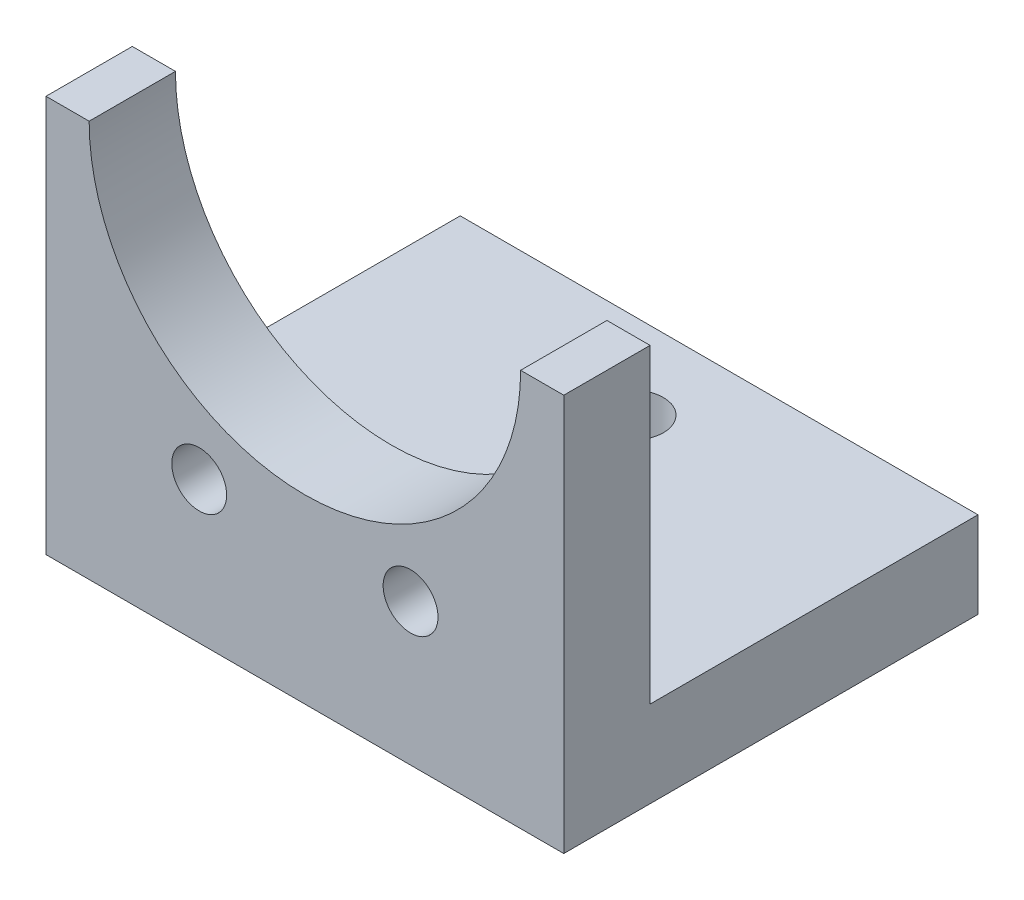
ISO-10303-21;
HEADER;
FILE_DESCRIPTION(('STEP AP214'),'2;1');
FILE_NAME('part.step','',(''),(''),'','','');
FILE_SCHEMA(('AUTOMOTIVE_DESIGN { 1 0 10303 214 1 1 1 1 }'));
ENDSEC;
DATA;
#1=APPLICATION_CONTEXT('core data for automotive mechanical design processes');
#2=APPLICATION_PROTOCOL_DEFINITION('international standard','automotive_design',2000,#1);
#3=PRODUCT_CONTEXT('',#1,'mechanical');
#4=PRODUCT('Part','Part','',(#3));
#5=PRODUCT_RELATED_PRODUCT_CATEGORY('part','',(#4));
#6=PRODUCT_DEFINITION_FORMATION('','',#4);
#7=PRODUCT_DEFINITION_CONTEXT('part definition',#1,'design');
#8=PRODUCT_DEFINITION('design','',#6,#7);
#9=PRODUCT_DEFINITION_SHAPE('','',#8);
#10=(LENGTH_UNIT() NAMED_UNIT(*) SI_UNIT(.MILLI.,.METRE.));
#11=(NAMED_UNIT(*) PLANE_ANGLE_UNIT() SI_UNIT($,.RADIAN.));
#12=(NAMED_UNIT(*) SI_UNIT($,.STERADIAN.) SOLID_ANGLE_UNIT());
#13=UNCERTAINTY_MEASURE_WITH_UNIT(LENGTH_MEASURE(1.E-05),#10,'distance_accuracy_value','');
#14=(GEOMETRIC_REPRESENTATION_CONTEXT(3) GLOBAL_UNCERTAINTY_ASSIGNED_CONTEXT((#13)) GLOBAL_UNIT_ASSIGNED_CONTEXT((#10,
#11,#12)) REPRESENTATION_CONTEXT('',''));
#15=CARTESIAN_POINT('',(0.,0.,0.));
#16=DIRECTION('',(0.,0.,1.));
#17=DIRECTION('',(1.,0.,0.));
#18=AXIS2_PLACEMENT_3D('',#15,#16,#17);
#19=CARTESIAN_POINT('',(-19.05,29.21,11.43));
#20=DIRECTION('',(0.,-1.,0.));
#21=DIRECTION('',(0.,0.,-1.));
#22=AXIS2_PLACEMENT_3D('',#19,#20,#21);
#23=PLANE('',#22);
#24=DIRECTION('',(-1.,0.,0.));
#25=VECTOR('',#24,1.);
#26=CARTESIAN_POINT('',(-19.05,29.21,11.43));
#27=LINE('',#26,#25);
#28=CARTESIAN_POINT('',(19.05,29.21,11.43));
#29=VERTEX_POINT('',#28);
#30=CARTESIAN_POINT('',(15.875,29.21,11.43));
#31=VERTEX_POINT('',#30);
#32=EDGE_CURVE('E114',#29,#31,#27,.T.);
#33=ORIENTED_EDGE('',*,*,#32,.T.);
#34=DIRECTION('',(0.,0.,1.));
#35=VECTOR('',#34,1.);
#36=CARTESIAN_POINT('',(15.875,29.21,-7.62));
#37=LINE('',#36,#35);
#38=CARTESIAN_POINT('',(15.875,29.21,17.78));
#39=VERTEX_POINT('',#38);
#40=EDGE_CURVE('E11',#31,#39,#37,.T.);
#41=ORIENTED_EDGE('',*,*,#40,.T.);
#42=DIRECTION('',(1.,0.,0.));
#43=VECTOR('',#42,1.);
#44=CARTESIAN_POINT('',(-19.05,29.21,17.78));
#45=LINE('',#44,#43);
#46=CARTESIAN_POINT('',(19.05,29.21,17.78));
#47=VERTEX_POINT('',#46);
#48=EDGE_CURVE('E111',#39,#47,#45,.T.);
#49=ORIENTED_EDGE('',*,*,#48,.T.);
#50=DIRECTION('',(0.,0.,-1.));
#51=VECTOR('',#50,1.);
#52=CARTESIAN_POINT('',(19.05,29.21,17.78));
#53=LINE('',#52,#51);
#54=EDGE_CURVE('E122',#47,#29,#53,.T.);
#55=ORIENTED_EDGE('',*,*,#54,.T.);
#56=EDGE_LOOP('',(#33,#41,#49,#55));
#57=FACE_BOUND('',#56,.T.);
#58=ADVANCED_FACE('F36',(#57),#23,.F.);
#59=CARTESIAN_POINT('',(-19.05,6.35,-12.7));
#60=DIRECTION('',(1.,0.,0.));
#61=DIRECTION('',(0.,0.,-1.));
#62=AXIS2_PLACEMENT_3D('',#59,#60,#61);
#63=PLANE('',#62);
#64=DIRECTION('',(0.,0.,1.));
#65=VECTOR('',#64,1.);
#66=CARTESIAN_POINT('',(-19.05,0.,-12.7));
#67=LINE('',#66,#65);
#68=CARTESIAN_POINT('',(-19.05,0.,-12.7));
#69=VERTEX_POINT('',#68);
#70=CARTESIAN_POINT('',(-19.05,0.,17.78));
#71=VERTEX_POINT('',#70);
#72=EDGE_CURVE('E148',#69,#71,#67,.T.);
#73=ORIENTED_EDGE('',*,*,#72,.T.);
#74=DIRECTION('',(0.,-1.,0.));
#75=VECTOR('',#74,1.);
#76=CARTESIAN_POINT('',(-19.05,6.35,17.78));
#77=LINE('',#76,#75);
#78=CARTESIAN_POINT('',(-19.05,29.21,17.78));
#79=VERTEX_POINT('',#78);
#80=EDGE_CURVE('E151',#79,#71,#77,.T.);
#81=ORIENTED_EDGE('',*,*,#80,.F.);
#82=DIRECTION('',(0.,0.,1.));
#83=VECTOR('',#82,1.);
#84=CARTESIAN_POINT('',(-19.05,29.21,17.78));
#85=LINE('',#84,#83);
#86=CARTESIAN_POINT('',(-19.05,29.21,11.43));
#87=VERTEX_POINT('',#86);
#88=EDGE_CURVE('E120',#87,#79,#85,.T.);
#89=ORIENTED_EDGE('',*,*,#88,.F.);
#90=DIRECTION('',(0.,-1.,0.));
#91=VECTOR('',#90,1.);
#92=CARTESIAN_POINT('',(-19.05,29.21,11.43));
#93=LINE('',#92,#91);
#94=CARTESIAN_POINT('',(-19.05,6.35,11.43));
#95=VERTEX_POINT('',#94);
#96=EDGE_CURVE('E130',#87,#95,#93,.T.);
#97=ORIENTED_EDGE('',*,*,#96,.T.);
#98=DIRECTION('',(0.,0.,1.));
#99=VECTOR('',#98,1.);
#100=CARTESIAN_POINT('',(-19.05,6.35,-12.7));
#101=LINE('',#100,#99);
#102=CARTESIAN_POINT('',(-19.05,6.35,-12.7));
#103=VERTEX_POINT('',#102);
#104=EDGE_CURVE('E254',#103,#95,#101,.T.);
#105=ORIENTED_EDGE('',*,*,#104,.F.);
#106=DIRECTION('',(0.,-1.,0.));
#107=VECTOR('',#106,1.);
#108=CARTESIAN_POINT('',(-19.05,6.35,-12.7));
#109=LINE('',#108,#107);
#110=EDGE_CURVE('E243',#103,#69,#109,.T.);
#111=ORIENTED_EDGE('',*,*,#110,.T.);
#112=EDGE_LOOP('',(#73,#81,#89,#97,#105,#111));
#113=FACE_BOUND('',#112,.T.);
#114=ADVANCED_FACE('F38',(#113),#63,.F.);
#115=CARTESIAN_POINT('',(-19.05,6.35,17.78));
#116=DIRECTION('',(0.,0.,-1.));
#117=DIRECTION('',(-1.,0.,0.));
#118=AXIS2_PLACEMENT_3D('',#115,#116,#117);
#119=PLANE('',#118);
#120=CARTESIAN_POINT('',(-7.77612734565865,10.4367678993707,17.78));
#121=DIRECTION('',(0.,0.,1.));
#122=DIRECTION('',(1.,0.,0.));
#123=AXIS2_PLACEMENT_3D('',#120,#121,#122);
#124=CIRCLE('',#123,2.0193);
#125=CARTESIAN_POINT('',(-5.75682734565865,10.4367678993707,17.78));
#126=VERTEX_POINT('',#125);
#127=EDGE_CURVE('E161',#126,#126,#124,.T.);
#128=ORIENTED_EDGE('',*,*,#127,.F.);
#129=EDGE_LOOP('',(#128));
#130=FACE_BOUND('',#129,.T.);
#131=CARTESIAN_POINT('',(7.77612734565864,10.4367678993707,17.78));
#132=DIRECTION('',(0.,0.,1.));
#133=DIRECTION('',(1.,0.,0.));
#134=AXIS2_PLACEMENT_3D('',#131,#132,#133);
#135=CIRCLE('',#134,2.0193);
#136=CARTESIAN_POINT('',(9.79542734565863,10.4367678993707,17.78));
#137=VERTEX_POINT('',#136);
#138=EDGE_CURVE('E153',#137,#137,#135,.T.);
#139=ORIENTED_EDGE('',*,*,#138,.F.);
#140=EDGE_LOOP('',(#139));
#141=FACE_BOUND('',#140,.T.);
#142=ORIENTED_EDGE('',*,*,#48,.F.);
#143=CARTESIAN_POINT('',(0.,29.21,17.78));
#144=DIRECTION('',(0.,0.,1.));
#145=DIRECTION('',(1.,0.,0.));
#146=AXIS2_PLACEMENT_3D('',#143,#144,#145);
#147=CIRCLE('',#146,15.875);
#148=CARTESIAN_POINT('',(-15.875,29.21,17.78));
#149=VERTEX_POINT('',#148);
#150=EDGE_CURVE('E101',#149,#39,#147,.T.);
#151=ORIENTED_EDGE('',*,*,#150,.F.);
#152=EDGE_CURVE('E119',#79,#149,#45,.T.);
#153=ORIENTED_EDGE('',*,*,#152,.F.);
#154=ORIENTED_EDGE('',*,*,#80,.T.);
#155=DIRECTION('',(1.,0.,0.));
#156=VECTOR('',#155,1.);
#157=CARTESIAN_POINT('',(-19.05,0.,17.78));
#158=LINE('',#157,#156);
#159=CARTESIAN_POINT('',(19.05,0.,17.78));
#160=VERTEX_POINT('',#159);
#161=EDGE_CURVE('E237',#71,#160,#158,.T.);
#162=ORIENTED_EDGE('',*,*,#161,.T.);
#163=DIRECTION('',(0.,-1.,0.));
#164=VECTOR('',#163,1.);
#165=CARTESIAN_POINT('',(19.05,6.35,17.78));
#166=LINE('',#165,#164);
#167=EDGE_CURVE('E117',#47,#160,#166,.T.);
#168=ORIENTED_EDGE('',*,*,#167,.F.);
#169=EDGE_LOOP('',(#142,#151,#153,#154,#162,#168));
#170=FACE_BOUND('',#169,.T.);
#171=ADVANCED_FACE('F115',(#130,#141,#170),#119,.F.);
#172=CARTESIAN_POINT('',(19.05,6.35,-12.7));
#173=DIRECTION('',(-1.,0.,0.));
#174=DIRECTION('',(0.,0.,1.));
#175=AXIS2_PLACEMENT_3D('',#172,#173,#174);
#176=PLANE('',#175);
#177=DIRECTION('',(0.,0.,-1.));
#178=VECTOR('',#177,1.);
#179=CARTESIAN_POINT('',(19.05,0.,-12.7));
#180=LINE('',#179,#178);
#181=CARTESIAN_POINT('',(19.05,0.,-12.7));
#182=VERTEX_POINT('',#181);
#183=EDGE_CURVE('E246',#160,#182,#180,.T.);
#184=ORIENTED_EDGE('',*,*,#183,.T.);
#185=DIRECTION('',(0.,-1.,0.));
#186=VECTOR('',#185,1.);
#187=CARTESIAN_POINT('',(19.05,6.35,-12.7));
#188=LINE('',#187,#186);
#189=CARTESIAN_POINT('',(19.05,6.35,-12.7));
#190=VERTEX_POINT('',#189);
#191=EDGE_CURVE('E256',#190,#182,#188,.T.);
#192=ORIENTED_EDGE('',*,*,#191,.F.);
#193=DIRECTION('',(0.,0.,-1.));
#194=VECTOR('',#193,1.);
#195=CARTESIAN_POINT('',(19.05,6.35,-12.7));
#196=LINE('',#195,#194);
#197=CARTESIAN_POINT('',(19.05,6.35,11.43));
#198=VERTEX_POINT('',#197);
#199=EDGE_CURVE('E139',#198,#190,#196,.T.);
#200=ORIENTED_EDGE('',*,*,#199,.F.);
#201=DIRECTION('',(0.,-1.,0.));
#202=VECTOR('',#201,1.);
#203=CARTESIAN_POINT('',(19.05,29.21,11.43));
#204=LINE('',#203,#202);
#205=EDGE_CURVE('E143',#29,#198,#204,.T.);
#206=ORIENTED_EDGE('',*,*,#205,.F.);
#207=ORIENTED_EDGE('',*,*,#54,.F.);
#208=ORIENTED_EDGE('',*,*,#167,.T.);
#209=EDGE_LOOP('',(#184,#192,#200,#206,#207,#208));
#210=FACE_BOUND('',#209,.T.);
#211=ADVANCED_FACE('F213',(#210),#176,.F.);
#212=CARTESIAN_POINT('',(-19.05,6.35,-12.7));
#213=DIRECTION('',(0.,0.,1.));
#214=DIRECTION('',(1.,0.,0.));
#215=AXIS2_PLACEMENT_3D('',#212,#213,#214);
#216=PLANE('',#215);
#217=DIRECTION('',(-1.,0.,0.));
#218=VECTOR('',#217,1.);
#219=CARTESIAN_POINT('',(-19.05,0.,-12.7));
#220=LINE('',#219,#218);
#221=EDGE_CURVE('E252',#182,#69,#220,.T.);
#222=ORIENTED_EDGE('',*,*,#221,.T.);
#223=ORIENTED_EDGE('',*,*,#110,.F.);
#224=DIRECTION('',(-1.,0.,0.));
#225=VECTOR('',#224,1.);
#226=CARTESIAN_POINT('',(-19.05,6.35,-12.7));
#227=LINE('',#226,#225);
#228=EDGE_CURVE('E249',#190,#103,#227,.T.);
#229=ORIENTED_EDGE('',*,*,#228,.F.);
#230=ORIENTED_EDGE('',*,*,#191,.T.);
#231=EDGE_LOOP('',(#222,#223,#229,#230));
#232=FACE_BOUND('',#231,.T.);
#233=ADVANCED_FACE('F206',(#232),#216,.F.);
#234=CARTESIAN_POINT('',(-19.05,6.35,17.78));
#235=DIRECTION('',(0.,1.,0.));
#236=DIRECTION('',(0.,0.,1.));
#237=AXIS2_PLACEMENT_3D('',#234,#235,#236);
#238=PLANE('',#237);
#239=CARTESIAN_POINT('',(0.,6.35,6.35));
#240=DIRECTION('',(0.,1.,0.));
#241=DIRECTION('',(0.,0.,1.));
#242=AXIS2_PLACEMENT_3D('',#239,#240,#241);
#243=CIRCLE('',#242,2.24789999999999);
#244=CARTESIAN_POINT('',(0.,6.35,8.59789999999999));
#245=VERTEX_POINT('',#244);
#246=EDGE_CURVE('E165',#245,#245,#243,.T.);
#247=ORIENTED_EDGE('',*,*,#246,.F.);
#248=EDGE_LOOP('',(#247));
#249=FACE_BOUND('',#248,.T.);
#250=CARTESIAN_POINT('',(0.,6.35,-6.35));
#251=DIRECTION('',(0.,1.,0.));
#252=DIRECTION('',(0.,0.,1.));
#253=AXIS2_PLACEMENT_3D('',#250,#251,#252);
#254=CIRCLE('',#253,2.24789999999999);
#255=CARTESIAN_POINT('',(0.,6.35,-4.10210000000001));
#256=VERTEX_POINT('',#255);
#257=EDGE_CURVE('E171',#256,#256,#254,.T.);
#258=ORIENTED_EDGE('',*,*,#257,.F.);
#259=EDGE_LOOP('',(#258));
#260=FACE_BOUND('',#259,.T.);
#261=DIRECTION('',(-1.,0.,0.));
#262=VECTOR('',#261,1.);
#263=CARTESIAN_POINT('',(-19.05,6.35,11.43));
#264=LINE('',#263,#262);
#265=EDGE_CURVE('E61',#198,#95,#264,.T.);
#266=ORIENTED_EDGE('',*,*,#265,.F.);
#267=ORIENTED_EDGE('',*,*,#199,.T.);
#268=ORIENTED_EDGE('',*,*,#228,.T.);
#269=ORIENTED_EDGE('',*,*,#104,.T.);
#270=EDGE_LOOP('',(#266,#267,#268,#269));
#271=FACE_BOUND('',#270,.T.);
#272=ADVANCED_FACE('F203',(#249,#260,#271),#238,.T.);
#273=CARTESIAN_POINT('',(-19.05,0.,17.78));
#274=DIRECTION('',(0.,1.,0.));
#275=DIRECTION('',(0.,0.,1.));
#276=AXIS2_PLACEMENT_3D('',#273,#274,#275);
#277=PLANE('',#276);
#278=CARTESIAN_POINT('',(0.,0.,6.35));
#279=DIRECTION('',(0.,1.,0.));
#280=DIRECTION('',(0.,0.,1.));
#281=AXIS2_PLACEMENT_3D('',#278,#279,#280);
#282=CIRCLE('',#281,2.24789999999998);
#283=CARTESIAN_POINT('',(0.,0.,8.59789999999998));
#284=VERTEX_POINT('',#283);
#285=EDGE_CURVE('E168',#284,#284,#282,.T.);
#286=ORIENTED_EDGE('',*,*,#285,.T.);
#287=EDGE_LOOP('',(#286));
#288=FACE_BOUND('',#287,.T.);
#289=CARTESIAN_POINT('',(0.,0.,-6.35));
#290=DIRECTION('',(0.,1.,0.));
#291=DIRECTION('',(0.,0.,1.));
#292=AXIS2_PLACEMENT_3D('',#289,#290,#291);
#293=CIRCLE('',#292,2.24789999999998);
#294=CARTESIAN_POINT('',(0.,0.,-4.10210000000002));
#295=VERTEX_POINT('',#294);
#296=EDGE_CURVE('E138',#295,#295,#293,.T.);
#297=ORIENTED_EDGE('',*,*,#296,.T.);
#298=EDGE_LOOP('',(#297));
#299=FACE_BOUND('',#298,.T.);
#300=ORIENTED_EDGE('',*,*,#72,.F.);
#301=ORIENTED_EDGE('',*,*,#221,.F.);
#302=ORIENTED_EDGE('',*,*,#183,.F.);
#303=ORIENTED_EDGE('',*,*,#161,.F.);
#304=EDGE_LOOP('',(#300,#301,#302,#303));
#305=FACE_BOUND('',#304,.T.);
#306=ADVANCED_FACE('F176',(#288,#299,#305),#277,.F.);
#307=CARTESIAN_POINT('',(-19.05,29.21,11.43));
#308=DIRECTION('',(0.,0.,1.));
#309=DIRECTION('',(1.,0.,0.));
#310=AXIS2_PLACEMENT_3D('',#307,#308,#309);
#311=PLANE('',#310);
#312=CARTESIAN_POINT('',(-7.77612734565865,10.4367678993707,11.43));
#313=DIRECTION('',(0.,0.,1.));
#314=DIRECTION('',(1.,0.,0.));
#315=AXIS2_PLACEMENT_3D('',#312,#313,#314);
#316=CIRCLE('',#315,2.01929999999999);
#317=CARTESIAN_POINT('',(-5.75682734565865,10.4367678993707,11.43));
#318=VERTEX_POINT('',#317);
#319=EDGE_CURVE('E40',#318,#318,#316,.T.);
#320=ORIENTED_EDGE('',*,*,#319,.T.);
#321=EDGE_LOOP('',(#320));
#322=FACE_BOUND('',#321,.T.);
#323=CARTESIAN_POINT('',(7.77612734565864,10.4367678993707,11.43));
#324=DIRECTION('',(0.,0.,1.));
#325=DIRECTION('',(1.,0.,0.));
#326=AXIS2_PLACEMENT_3D('',#323,#324,#325);
#327=CIRCLE('',#326,2.01929999999999);
#328=CARTESIAN_POINT('',(9.79542734565863,10.4367678993707,11.43));
#329=VERTEX_POINT('',#328);
#330=EDGE_CURVE('E107',#329,#329,#327,.T.);
#331=ORIENTED_EDGE('',*,*,#330,.T.);
#332=EDGE_LOOP('',(#331));
#333=FACE_BOUND('',#332,.T.);
#334=CARTESIAN_POINT('',(-15.875,29.21,11.43));
#335=VERTEX_POINT('',#334);
#336=EDGE_CURVE('E128',#335,#87,#27,.T.);
#337=ORIENTED_EDGE('',*,*,#336,.F.);
#338=CARTESIAN_POINT('',(0.,29.21,11.43));
#339=DIRECTION('',(0.,0.,1.));
#340=DIRECTION('',(1.,0.,0.));
#341=AXIS2_PLACEMENT_3D('',#338,#339,#340);
#342=CIRCLE('',#341,15.875);
#343=EDGE_CURVE('E53',#335,#31,#342,.T.);
#344=ORIENTED_EDGE('',*,*,#343,.T.);
#345=ORIENTED_EDGE('',*,*,#32,.F.);
#346=ORIENTED_EDGE('',*,*,#205,.T.);
#347=ORIENTED_EDGE('',*,*,#265,.T.);
#348=ORIENTED_EDGE('',*,*,#96,.F.);
#349=EDGE_LOOP('',(#337,#344,#345,#346,#347,#348));
#350=FACE_BOUND('',#349,.T.);
#351=ADVANCED_FACE('F191',(#322,#333,#350),#311,.F.);
#352=ORIENTED_EDGE('',*,*,#152,.T.);
#353=DIRECTION('',(0.,0.,1.));
#354=VECTOR('',#353,1.);
#355=CARTESIAN_POINT('',(-15.875,29.21,-7.62));
#356=LINE('',#355,#354);
#357=EDGE_CURVE('E45',#149,#335,#356,.F.);
#358=ORIENTED_EDGE('',*,*,#357,.T.);
#359=ORIENTED_EDGE('',*,*,#336,.T.);
#360=ORIENTED_EDGE('',*,*,#88,.T.);
#361=EDGE_LOOP('',(#352,#358,#359,#360));
#362=FACE_BOUND('',#361,.T.);
#363=ADVANCED_FACE('F182',(#362),#23,.F.);
#364=CARTESIAN_POINT('',(0.,6.35,-6.35));
#365=DIRECTION('',(0.,1.,0.));
#366=DIRECTION('',(0.,0.,1.));
#367=AXIS2_PLACEMENT_3D('',#364,#365,#366);
#368=CYLINDRICAL_SURFACE('',#367,2.24789999999998);
#369=ORIENTED_EDGE('',*,*,#257,.T.);
#370=EDGE_LOOP('',(#369));
#371=FACE_BOUND('',#370,.T.);
#372=ORIENTED_EDGE('',*,*,#296,.F.);
#373=EDGE_LOOP('',(#372));
#374=FACE_BOUND('',#373,.T.);
#375=ADVANCED_FACE('F179',(#371,#374),#368,.F.);
#376=CARTESIAN_POINT('',(0.,6.35,6.35));
#377=DIRECTION('',(0.,1.,0.));
#378=DIRECTION('',(0.,0.,1.));
#379=AXIS2_PLACEMENT_3D('',#376,#377,#378);
#380=CYLINDRICAL_SURFACE('',#379,2.24789999999998);
#381=ORIENTED_EDGE('',*,*,#246,.T.);
#382=EDGE_LOOP('',(#381));
#383=FACE_BOUND('',#382,.T.);
#384=ORIENTED_EDGE('',*,*,#285,.F.);
#385=EDGE_LOOP('',(#384));
#386=FACE_BOUND('',#385,.T.);
#387=ADVANCED_FACE('F181',(#383,#386),#380,.F.);
#388=CARTESIAN_POINT('',(0.,29.21,-7.62));
#389=DIRECTION('',(0.,0.,1.));
#390=DIRECTION('',(1.,0.,0.));
#391=AXIS2_PLACEMENT_3D('',#388,#389,#390);
#392=CYLINDRICAL_SURFACE('',#391,15.875);
#393=ORIENTED_EDGE('',*,*,#343,.F.);
#394=ORIENTED_EDGE('',*,*,#357,.F.);
#395=ORIENTED_EDGE('',*,*,#150,.T.);
#396=ORIENTED_EDGE('',*,*,#40,.F.);
#397=EDGE_LOOP('',(#393,#394,#395,#396));
#398=FACE_BOUND('',#397,.T.);
#399=ADVANCED_FACE('F102',(#398),#392,.F.);
#400=CARTESIAN_POINT('',(7.77612734565864,10.4367678993707,17.78));
#401=DIRECTION('',(0.,0.,1.));
#402=DIRECTION('',(1.,0.,0.));
#403=AXIS2_PLACEMENT_3D('',#400,#401,#402);
#404=CYLINDRICAL_SURFACE('',#403,2.01929999999999);
#405=ORIENTED_EDGE('',*,*,#138,.T.);
#406=EDGE_LOOP('',(#405));
#407=FACE_BOUND('',#406,.T.);
#408=ORIENTED_EDGE('',*,*,#330,.F.);
#409=EDGE_LOOP('',(#408));
#410=FACE_BOUND('',#409,.T.);
#411=ADVANCED_FACE('F228',(#407,#410),#404,.F.);
#412=CARTESIAN_POINT('',(-7.77612734565865,10.4367678993707,17.78));
#413=DIRECTION('',(0.,0.,1.));
#414=DIRECTION('',(1.,0.,0.));
#415=AXIS2_PLACEMENT_3D('',#412,#413,#414);
#416=CYLINDRICAL_SURFACE('',#415,2.01929999999999);
#417=ORIENTED_EDGE('',*,*,#127,.T.);
#418=EDGE_LOOP('',(#417));
#419=FACE_BOUND('',#418,.T.);
#420=ORIENTED_EDGE('',*,*,#319,.F.);
#421=EDGE_LOOP('',(#420));
#422=FACE_BOUND('',#421,.T.);
#423=ADVANCED_FACE('F225',(#419,#422),#416,.F.);
#424=CLOSED_SHELL('',(#58,#114,#171,#211,#233,#272,#306,#351,#363,#375,#387,#399,#411,#423));
#425=MANIFOLD_SOLID_BREP('B2',#424);
#426=ADVANCED_BREP_SHAPE_REPRESENTATION('',(#18,#425),#14);
#427=SHAPE_DEFINITION_REPRESENTATION(#9,#426);
ENDSEC;
END-ISO-10303-21;
